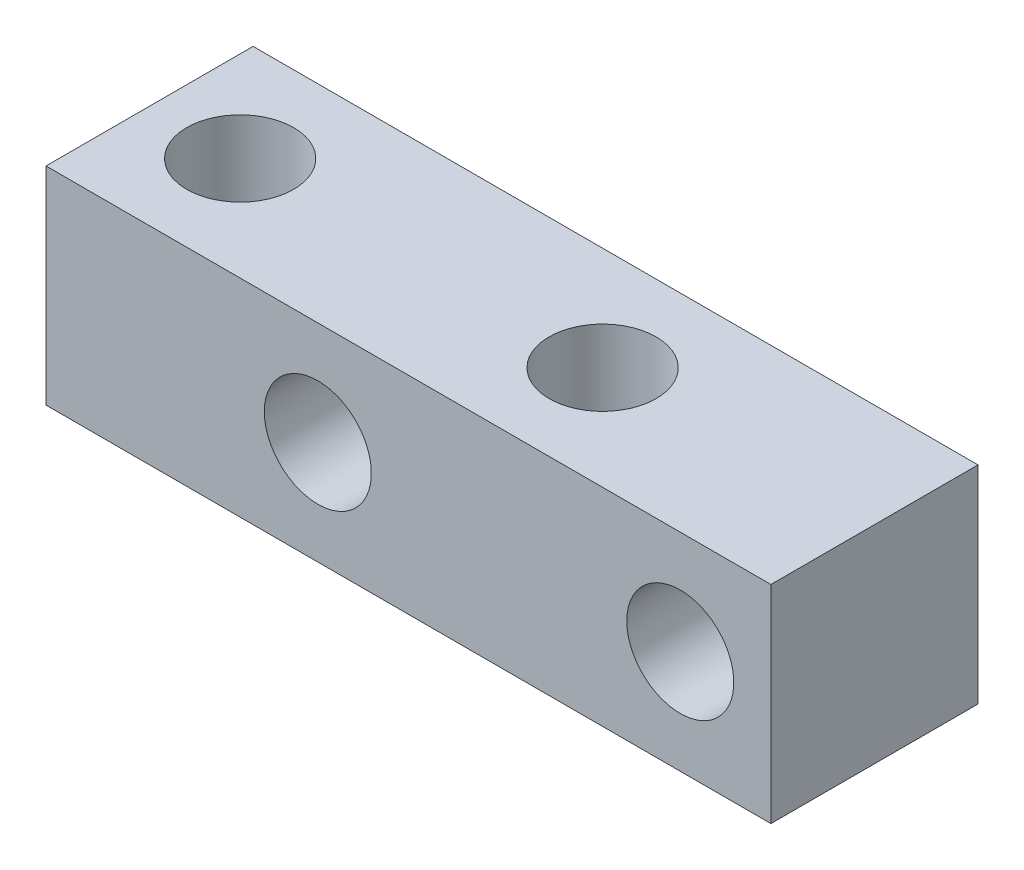
ISO-10303-21;
HEADER;
FILE_DESCRIPTION(('STEP AP214'),'2;1');
FILE_NAME('part.step','',(''),(''),'','','');
FILE_SCHEMA(('AUTOMOTIVE_DESIGN { 1 0 10303 214 1 1 1 1 }'));
ENDSEC;
DATA;
#1=APPLICATION_CONTEXT('core data for automotive mechanical design processes');
#2=APPLICATION_PROTOCOL_DEFINITION('international standard','automotive_design',2000,#1);
#3=PRODUCT_CONTEXT('',#1,'mechanical');
#4=PRODUCT('Part','Part','',(#3));
#5=PRODUCT_RELATED_PRODUCT_CATEGORY('part','',(#4));
#6=PRODUCT_DEFINITION_FORMATION('','',#4);
#7=PRODUCT_DEFINITION_CONTEXT('part definition',#1,'design');
#8=PRODUCT_DEFINITION('design','',#6,#7);
#9=PRODUCT_DEFINITION_SHAPE('','',#8);
#10=(LENGTH_UNIT() NAMED_UNIT(*) SI_UNIT(.MILLI.,.METRE.));
#11=(NAMED_UNIT(*) PLANE_ANGLE_UNIT() SI_UNIT($,.RADIAN.));
#12=(NAMED_UNIT(*) SI_UNIT($,.STERADIAN.) SOLID_ANGLE_UNIT());
#13=UNCERTAINTY_MEASURE_WITH_UNIT(LENGTH_MEASURE(1.E-05),#10,'distance_accuracy_value','');
#14=(GEOMETRIC_REPRESENTATION_CONTEXT(3) GLOBAL_UNCERTAINTY_ASSIGNED_CONTEXT((#13)) GLOBAL_UNIT_ASSIGNED_CONTEXT((#10,
#11,#12)) REPRESENTATION_CONTEXT('',''));
#15=CARTESIAN_POINT('',(0.,0.,0.));
#16=DIRECTION('',(0.,0.,1.));
#17=DIRECTION('',(1.,0.,0.));
#18=AXIS2_PLACEMENT_3D('',#15,#16,#17);
#19=CARTESIAN_POINT('',(10.5,6.,3.));
#20=DIRECTION('',(-1.,0.,0.));
#21=DIRECTION('',(0.,0.,1.));
#22=AXIS2_PLACEMENT_3D('',#19,#20,#21);
#23=PLANE('',#22);
#24=DIRECTION('',(0.,0.,-1.));
#25=VECTOR('',#24,1.);
#26=CARTESIAN_POINT('',(10.5,0.,3.));
#27=LINE('',#26,#25);
#28=CARTESIAN_POINT('',(10.5,0.,3.));
#29=VERTEX_POINT('',#28);
#30=CARTESIAN_POINT('',(10.5,0.,-3.));
#31=VERTEX_POINT('',#30);
#32=EDGE_CURVE('E102',#29,#31,#27,.T.);
#33=ORIENTED_EDGE('',*,*,#32,.T.);
#34=DIRECTION('',(0.,-1.,0.));
#35=VECTOR('',#34,1.);
#36=CARTESIAN_POINT('',(10.5,6.,-3.));
#37=LINE('',#36,#35);
#38=CARTESIAN_POINT('',(10.5,6.,-3.));
#39=VERTEX_POINT('',#38);
#40=EDGE_CURVE('E11',#39,#31,#37,.T.);
#41=ORIENTED_EDGE('',*,*,#40,.F.);
#42=DIRECTION('',(0.,0.,-1.));
#43=VECTOR('',#42,1.);
#44=CARTESIAN_POINT('',(10.5,6.,3.));
#45=LINE('',#44,#43);
#46=CARTESIAN_POINT('',(10.5,6.,3.));
#47=VERTEX_POINT('',#46);
#48=EDGE_CURVE('E90',#47,#39,#45,.T.);
#49=ORIENTED_EDGE('',*,*,#48,.F.);
#50=DIRECTION('',(0.,-1.,0.));
#51=VECTOR('',#50,1.);
#52=CARTESIAN_POINT('',(10.5,6.,3.));
#53=LINE('',#52,#51);
#54=EDGE_CURVE('E98',#47,#29,#53,.T.);
#55=ORIENTED_EDGE('',*,*,#54,.T.);
#56=EDGE_LOOP('',(#33,#41,#49,#55));
#57=FACE_BOUND('',#56,.T.);
#58=ADVANCED_FACE('F39',(#57),#23,.F.);
#59=CARTESIAN_POINT('',(-10.5,6.,-3.));
#60=DIRECTION('',(0.,0.,1.));
#61=DIRECTION('',(1.,0.,0.));
#62=AXIS2_PLACEMENT_3D('',#59,#60,#61);
#63=PLANE('',#62);
#64=CARTESIAN_POINT('',(7.875,3.,-3.));
#65=DIRECTION('',(0.,0.,-1.));
#66=DIRECTION('',(-1.,0.,0.));
#67=AXIS2_PLACEMENT_3D('',#64,#65,#66);
#68=CIRCLE('',#67,1.55);
#69=CARTESIAN_POINT('',(6.325,3.,-3.));
#70=VERTEX_POINT('',#69);
#71=EDGE_CURVE('E119',#70,#70,#68,.T.);
#72=ORIENTED_EDGE('',*,*,#71,.F.);
#73=EDGE_LOOP('',(#72));
#74=FACE_BOUND('',#73,.T.);
#75=CARTESIAN_POINT('',(-2.625,3.,-3.));
#76=DIRECTION('',(0.,0.,-1.));
#77=DIRECTION('',(-1.,0.,0.));
#78=AXIS2_PLACEMENT_3D('',#75,#76,#77);
#79=CIRCLE('',#78,1.55);
#80=CARTESIAN_POINT('',(-4.175,3.,-3.));
#81=VERTEX_POINT('',#80);
#82=EDGE_CURVE('E116',#81,#81,#79,.T.);
#83=ORIENTED_EDGE('',*,*,#82,.F.);
#84=EDGE_LOOP('',(#83));
#85=FACE_BOUND('',#84,.T.);
#86=DIRECTION('',(-1.,0.,0.));
#87=VECTOR('',#86,1.);
#88=CARTESIAN_POINT('',(-10.5,0.,-3.));
#89=LINE('',#88,#87);
#90=CARTESIAN_POINT('',(-10.5,0.,-3.));
#91=VERTEX_POINT('',#90);
#92=EDGE_CURVE('E94',#31,#91,#89,.T.);
#93=ORIENTED_EDGE('',*,*,#92,.T.);
#94=DIRECTION('',(0.,-1.,0.));
#95=VECTOR('',#94,1.);
#96=CARTESIAN_POINT('',(-10.5,6.,-3.));
#97=LINE('',#96,#95);
#98=CARTESIAN_POINT('',(-10.5,6.,-3.));
#99=VERTEX_POINT('',#98);
#100=EDGE_CURVE('E47',#99,#91,#97,.T.);
#101=ORIENTED_EDGE('',*,*,#100,.F.);
#102=DIRECTION('',(-1.,0.,0.));
#103=VECTOR('',#102,1.);
#104=CARTESIAN_POINT('',(-10.5,6.,-3.));
#105=LINE('',#104,#103);
#106=EDGE_CURVE('E85',#39,#99,#105,.T.);
#107=ORIENTED_EDGE('',*,*,#106,.F.);
#108=ORIENTED_EDGE('',*,*,#40,.T.);
#109=EDGE_LOOP('',(#93,#101,#107,#108));
#110=FACE_BOUND('',#109,.T.);
#111=ADVANCED_FACE('F93',(#74,#85,#110),#63,.F.);
#112=CARTESIAN_POINT('',(-10.5,6.,3.));
#113=DIRECTION('',(1.,0.,0.));
#114=DIRECTION('',(0.,0.,-1.));
#115=AXIS2_PLACEMENT_3D('',#112,#113,#114);
#116=PLANE('',#115);
#117=DIRECTION('',(0.,0.,1.));
#118=VECTOR('',#117,1.);
#119=CARTESIAN_POINT('',(-10.5,0.,3.));
#120=LINE('',#119,#118);
#121=CARTESIAN_POINT('',(-10.5,0.,3.));
#122=VERTEX_POINT('',#121);
#123=EDGE_CURVE('E72',#91,#122,#120,.T.);
#124=ORIENTED_EDGE('',*,*,#123,.T.);
#125=DIRECTION('',(0.,-1.,0.));
#126=VECTOR('',#125,1.);
#127=CARTESIAN_POINT('',(-10.5,6.,3.));
#128=LINE('',#127,#126);
#129=CARTESIAN_POINT('',(-10.5,6.,3.));
#130=VERTEX_POINT('',#129);
#131=EDGE_CURVE('E95',#130,#122,#128,.T.);
#132=ORIENTED_EDGE('',*,*,#131,.F.);
#133=DIRECTION('',(0.,0.,1.));
#134=VECTOR('',#133,1.);
#135=CARTESIAN_POINT('',(-10.5,6.,3.));
#136=LINE('',#135,#134);
#137=EDGE_CURVE('E88',#99,#130,#136,.T.);
#138=ORIENTED_EDGE('',*,*,#137,.F.);
#139=ORIENTED_EDGE('',*,*,#100,.T.);
#140=EDGE_LOOP('',(#124,#132,#138,#139));
#141=FACE_BOUND('',#140,.T.);
#142=ADVANCED_FACE('F96',(#141),#116,.F.);
#143=CARTESIAN_POINT('',(-10.5,6.,3.));
#144=DIRECTION('',(0.,0.,-1.));
#145=DIRECTION('',(-1.,0.,0.));
#146=AXIS2_PLACEMENT_3D('',#143,#144,#145);
#147=PLANE('',#146);
#148=CARTESIAN_POINT('',(7.875,3.,3.));
#149=DIRECTION('',(0.,0.,-1.));
#150=DIRECTION('',(-1.,0.,0.));
#151=AXIS2_PLACEMENT_3D('',#148,#149,#150);
#152=CIRCLE('',#151,1.55);
#153=CARTESIAN_POINT('',(6.325,3.,3.));
#154=VERTEX_POINT('',#153);
#155=EDGE_CURVE('E105',#154,#154,#152,.F.);
#156=ORIENTED_EDGE('',*,*,#155,.F.);
#157=EDGE_LOOP('',(#156));
#158=FACE_BOUND('',#157,.T.);
#159=CARTESIAN_POINT('',(-2.625,3.,3.));
#160=DIRECTION('',(0.,0.,-1.));
#161=DIRECTION('',(-1.,0.,0.));
#162=AXIS2_PLACEMENT_3D('',#159,#160,#161);
#163=CIRCLE('',#162,1.55);
#164=CARTESIAN_POINT('',(-4.175,3.,3.));
#165=VERTEX_POINT('',#164);
#166=EDGE_CURVE('E120',#165,#165,#163,.F.);
#167=ORIENTED_EDGE('',*,*,#166,.F.);
#168=EDGE_LOOP('',(#167));
#169=FACE_BOUND('',#168,.T.);
#170=DIRECTION('',(1.,0.,0.));
#171=VECTOR('',#170,1.);
#172=CARTESIAN_POINT('',(-10.5,0.,3.));
#173=LINE('',#172,#171);
#174=EDGE_CURVE('E78',#122,#29,#173,.T.);
#175=ORIENTED_EDGE('',*,*,#174,.T.);
#176=ORIENTED_EDGE('',*,*,#54,.F.);
#177=DIRECTION('',(1.,0.,0.));
#178=VECTOR('',#177,1.);
#179=CARTESIAN_POINT('',(-10.5,6.,3.));
#180=LINE('',#179,#178);
#181=EDGE_CURVE('E55',#130,#47,#180,.T.);
#182=ORIENTED_EDGE('',*,*,#181,.F.);
#183=ORIENTED_EDGE('',*,*,#131,.T.);
#184=EDGE_LOOP('',(#175,#176,#182,#183));
#185=FACE_BOUND('',#184,.T.);
#186=ADVANCED_FACE('F110',(#158,#169,#185),#147,.F.);
#187=CARTESIAN_POINT('',(0.,6.,0.));
#188=DIRECTION('',(0.,-1.,0.));
#189=DIRECTION('',(0.,0.,-1.));
#190=AXIS2_PLACEMENT_3D('',#187,#188,#189);
#191=PLANE('',#190);
#192=CARTESIAN_POINT('',(-7.875,6.,0.));
#193=DIRECTION('',(0.,-1.,0.));
#194=DIRECTION('',(0.,0.,-1.));
#195=AXIS2_PLACEMENT_3D('',#192,#193,#194);
#196=CIRCLE('',#195,1.55);
#197=CARTESIAN_POINT('',(-7.875,6.,-1.55));
#198=VERTEX_POINT('',#197);
#199=EDGE_CURVE('E123',#198,#198,#196,.F.);
#200=ORIENTED_EDGE('',*,*,#199,.F.);
#201=EDGE_LOOP('',(#200));
#202=FACE_BOUND('',#201,.T.);
#203=CARTESIAN_POINT('',(2.625,6.,0.));
#204=DIRECTION('',(0.,-1.,0.));
#205=DIRECTION('',(0.,0.,-1.));
#206=AXIS2_PLACEMENT_3D('',#203,#204,#205);
#207=CIRCLE('',#206,1.55);
#208=CARTESIAN_POINT('',(2.625,6.,-1.55));
#209=VERTEX_POINT('',#208);
#210=EDGE_CURVE('E132',#209,#209,#207,.F.);
#211=ORIENTED_EDGE('',*,*,#210,.F.);
#212=EDGE_LOOP('',(#211));
#213=FACE_BOUND('',#212,.T.);
#214=ORIENTED_EDGE('',*,*,#48,.T.);
#215=ORIENTED_EDGE('',*,*,#106,.T.);
#216=ORIENTED_EDGE('',*,*,#137,.T.);
#217=ORIENTED_EDGE('',*,*,#181,.T.);
#218=EDGE_LOOP('',(#214,#215,#216,#217));
#219=FACE_BOUND('',#218,.T.);
#220=ADVANCED_FACE('F86',(#202,#213,#219),#191,.F.);
#221=CARTESIAN_POINT('',(0.,0.,0.));
#222=DIRECTION('',(0.,-1.,0.));
#223=DIRECTION('',(0.,0.,-1.));
#224=AXIS2_PLACEMENT_3D('',#221,#222,#223);
#225=PLANE('',#224);
#226=CARTESIAN_POINT('',(-7.875,0.,0.));
#227=DIRECTION('',(0.,-1.,0.));
#228=DIRECTION('',(0.,0.,-1.));
#229=AXIS2_PLACEMENT_3D('',#226,#227,#228);
#230=CIRCLE('',#229,1.55);
#231=CARTESIAN_POINT('',(-7.875,0.,-1.55));
#232=VERTEX_POINT('',#231);
#233=EDGE_CURVE('E131',#232,#232,#230,.T.);
#234=ORIENTED_EDGE('',*,*,#233,.F.);
#235=EDGE_LOOP('',(#234));
#236=FACE_BOUND('',#235,.T.);
#237=CARTESIAN_POINT('',(2.625,0.,0.));
#238=DIRECTION('',(0.,-1.,0.));
#239=DIRECTION('',(0.,0.,-1.));
#240=AXIS2_PLACEMENT_3D('',#237,#238,#239);
#241=CIRCLE('',#240,1.55);
#242=CARTESIAN_POINT('',(2.625,0.,-1.55));
#243=VERTEX_POINT('',#242);
#244=EDGE_CURVE('E128',#243,#243,#241,.T.);
#245=ORIENTED_EDGE('',*,*,#244,.F.);
#246=EDGE_LOOP('',(#245));
#247=FACE_BOUND('',#246,.T.);
#248=ORIENTED_EDGE('',*,*,#32,.F.);
#249=ORIENTED_EDGE('',*,*,#174,.F.);
#250=ORIENTED_EDGE('',*,*,#123,.F.);
#251=ORIENTED_EDGE('',*,*,#92,.F.);
#252=EDGE_LOOP('',(#248,#249,#250,#251));
#253=FACE_BOUND('',#252,.T.);
#254=ADVANCED_FACE('F113',(#236,#247,#253),#225,.T.);
#255=CARTESIAN_POINT('',(-2.625,3.,7.3840620433566));
#256=DIRECTION('',(0.,0.,-1.));
#257=DIRECTION('',(-1.,0.,0.));
#258=AXIS2_PLACEMENT_3D('',#255,#256,#257);
#259=CYLINDRICAL_SURFACE('',#258,1.55);
#260=ORIENTED_EDGE('',*,*,#166,.T.);
#261=EDGE_LOOP('',(#260));
#262=FACE_BOUND('',#261,.T.);
#263=ORIENTED_EDGE('',*,*,#82,.T.);
#264=EDGE_LOOP('',(#263));
#265=FACE_BOUND('',#264,.T.);
#266=ADVANCED_FACE('F144',(#262,#265),#259,.F.);
#267=CARTESIAN_POINT('',(7.875,3.,7.3840620433566));
#268=DIRECTION('',(0.,0.,-1.));
#269=DIRECTION('',(-1.,0.,0.));
#270=AXIS2_PLACEMENT_3D('',#267,#268,#269);
#271=CYLINDRICAL_SURFACE('',#270,1.55);
#272=ORIENTED_EDGE('',*,*,#155,.T.);
#273=EDGE_LOOP('',(#272));
#274=FACE_BOUND('',#273,.T.);
#275=ORIENTED_EDGE('',*,*,#71,.T.);
#276=EDGE_LOOP('',(#275));
#277=FACE_BOUND('',#276,.T.);
#278=ADVANCED_FACE('F150',(#274,#277),#271,.F.);
#279=CARTESIAN_POINT('',(2.625,10.3840620433566,0.));
#280=DIRECTION('',(0.,-1.,0.));
#281=DIRECTION('',(0.,0.,-1.));
#282=AXIS2_PLACEMENT_3D('',#279,#280,#281);
#283=CYLINDRICAL_SURFACE('',#282,1.55);
#284=ORIENTED_EDGE('',*,*,#210,.T.);
#285=EDGE_LOOP('',(#284));
#286=FACE_BOUND('',#285,.T.);
#287=ORIENTED_EDGE('',*,*,#244,.T.);
#288=EDGE_LOOP('',(#287));
#289=FACE_BOUND('',#288,.T.);
#290=ADVANCED_FACE('F148',(#286,#289),#283,.F.);
#291=CARTESIAN_POINT('',(-7.875,10.3840620433566,0.));
#292=DIRECTION('',(0.,-1.,0.));
#293=DIRECTION('',(0.,0.,-1.));
#294=AXIS2_PLACEMENT_3D('',#291,#292,#293);
#295=CYLINDRICAL_SURFACE('',#294,1.55);
#296=ORIENTED_EDGE('',*,*,#199,.T.);
#297=EDGE_LOOP('',(#296));
#298=FACE_BOUND('',#297,.T.);
#299=ORIENTED_EDGE('',*,*,#233,.T.);
#300=EDGE_LOOP('',(#299));
#301=FACE_BOUND('',#300,.T.);
#302=ADVANCED_FACE('F140',(#298,#301),#295,.F.);
#303=CLOSED_SHELL('',(#58,#111,#142,#186,#220,#254,#266,#278,#290,#302));
#304=MANIFOLD_SOLID_BREP('B2',#303);
#305=ADVANCED_BREP_SHAPE_REPRESENTATION('',(#18,#304),#14);
#306=SHAPE_DEFINITION_REPRESENTATION(#9,#305);
ENDSEC;
END-ISO-10303-21;
